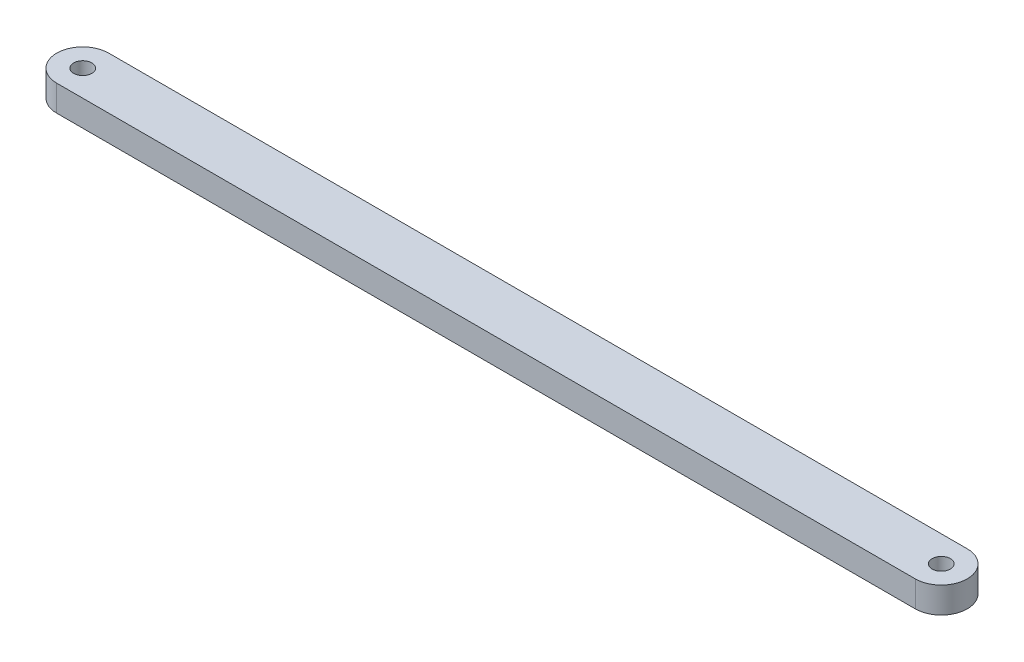
ISO-10303-21;
HEADER;
FILE_DESCRIPTION(('STEP AP214'),'2;1');
FILE_NAME('part.step','',(''),(''),'','','');
FILE_SCHEMA(('AUTOMOTIVE_DESIGN { 1 0 10303 214 1 1 1 1 }'));
ENDSEC;
DATA;
#1=APPLICATION_CONTEXT('core data for automotive mechanical design processes');
#2=APPLICATION_PROTOCOL_DEFINITION('international standard','automotive_design',2000,#1);
#3=PRODUCT_CONTEXT('',#1,'mechanical');
#4=PRODUCT('Part','Part','',(#3));
#5=PRODUCT_RELATED_PRODUCT_CATEGORY('part','',(#4));
#6=PRODUCT_DEFINITION_FORMATION('','',#4);
#7=PRODUCT_DEFINITION_CONTEXT('part definition',#1,'design');
#8=PRODUCT_DEFINITION('design','',#6,#7);
#9=PRODUCT_DEFINITION_SHAPE('','',#8);
#10=(LENGTH_UNIT() NAMED_UNIT(*) SI_UNIT(.MILLI.,.METRE.));
#11=(NAMED_UNIT(*) PLANE_ANGLE_UNIT() SI_UNIT($,.RADIAN.));
#12=(NAMED_UNIT(*) SI_UNIT($,.STERADIAN.) SOLID_ANGLE_UNIT());
#13=UNCERTAINTY_MEASURE_WITH_UNIT(LENGTH_MEASURE(1.E-05),#10,'distance_accuracy_value','');
#14=(GEOMETRIC_REPRESENTATION_CONTEXT(3) GLOBAL_UNCERTAINTY_ASSIGNED_CONTEXT((#13)) GLOBAL_UNIT_ASSIGNED_CONTEXT((#10,
#11,#12)) REPRESENTATION_CONTEXT('',''));
#15=CARTESIAN_POINT('',(0.,0.,0.));
#16=DIRECTION('',(0.,0.,1.));
#17=DIRECTION('',(1.,0.,0.));
#18=AXIS2_PLACEMENT_3D('',#15,#16,#17);
#19=CARTESIAN_POINT('',(-165.,10.,0.));
#20=DIRECTION('',(0.,1.,0.));
#21=DIRECTION('',(0.,0.,1.));
#22=AXIS2_PLACEMENT_3D('',#19,#20,#21);
#23=PLANE('',#22);
#24=CARTESIAN_POINT('',(-165.,10.,0.));
#25=DIRECTION('',(0.,1.,0.));
#26=DIRECTION('',(0.,0.,1.));
#27=AXIS2_PLACEMENT_3D('',#24,#25,#26);
#28=CIRCLE('',#27,3.49999999999999);
#29=CARTESIAN_POINT('',(-165.,10.,3.49999999999999));
#30=VERTEX_POINT('',#29);
#31=EDGE_CURVE('E106',#30,#30,#28,.T.);
#32=ORIENTED_EDGE('',*,*,#31,.F.);
#33=EDGE_LOOP('',(#32));
#34=FACE_BOUND('',#33,.T.);
#35=CARTESIAN_POINT('',(-165.,10.,0.));
#36=DIRECTION('',(0.,1.,0.));
#37=DIRECTION('',(0.,0.,1.));
#38=AXIS2_PLACEMENT_3D('',#35,#36,#37);
#39=CIRCLE('',#38,10.);
#40=CARTESIAN_POINT('',(-165.,10.,-10.));
#41=VERTEX_POINT('',#40);
#42=CARTESIAN_POINT('',(-165.,10.,10.));
#43=VERTEX_POINT('',#42);
#44=EDGE_CURVE('E91',#41,#43,#39,.T.);
#45=ORIENTED_EDGE('',*,*,#44,.T.);
#46=DIRECTION('',(1.,0.,0.));
#47=VECTOR('',#46,1.);
#48=CARTESIAN_POINT('',(-165.,10.,10.));
#49=LINE('',#48,#47);
#50=CARTESIAN_POINT('',(165.,10.,9.99999999999994));
#51=VERTEX_POINT('',#50);
#52=EDGE_CURVE('E86',#43,#51,#49,.T.);
#53=ORIENTED_EDGE('',*,*,#52,.T.);
#54=CARTESIAN_POINT('',(165.,10.,0.));
#55=DIRECTION('',(0.,1.,0.));
#56=DIRECTION('',(0.,0.,1.));
#57=AXIS2_PLACEMENT_3D('',#54,#55,#56);
#58=CIRCLE('',#57,10.);
#59=CARTESIAN_POINT('',(165.,10.,-10.0000000000001));
#60=VERTEX_POINT('',#59);
#61=EDGE_CURVE('E89',#51,#60,#58,.T.);
#62=ORIENTED_EDGE('',*,*,#61,.T.);
#63=DIRECTION('',(-1.,0.,0.));
#64=VECTOR('',#63,1.);
#65=CARTESIAN_POINT('',(-165.,10.,-10.));
#66=LINE('',#65,#64);
#67=EDGE_CURVE('E56',#60,#41,#66,.T.);
#68=ORIENTED_EDGE('',*,*,#67,.T.);
#69=EDGE_LOOP('',(#45,#53,#62,#68));
#70=FACE_BOUND('',#69,.T.);
#71=CARTESIAN_POINT('',(165.,10.,0.));
#72=DIRECTION('',(0.,1.,0.));
#73=DIRECTION('',(0.,0.,1.));
#74=AXIS2_PLACEMENT_3D('',#71,#72,#73);
#75=CIRCLE('',#74,3.49999999999999);
#76=CARTESIAN_POINT('',(165.,10.,3.49999999999993));
#77=VERTEX_POINT('',#76);
#78=EDGE_CURVE('E121',#77,#77,#75,.T.);
#79=ORIENTED_EDGE('',*,*,#78,.F.);
#80=EDGE_LOOP('',(#79));
#81=FACE_BOUND('',#80,.T.);
#82=ADVANCED_FACE('F39',(#34,#70,#81),#23,.T.);
#83=CARTESIAN_POINT('',(-165.,0.,0.));
#84=DIRECTION('',(0.,1.,0.));
#85=DIRECTION('',(0.,0.,1.));
#86=AXIS2_PLACEMENT_3D('',#83,#84,#85);
#87=PLANE('',#86);
#88=CARTESIAN_POINT('',(-165.,0.,0.));
#89=DIRECTION('',(0.,1.,0.));
#90=DIRECTION('',(0.,0.,1.));
#91=AXIS2_PLACEMENT_3D('',#88,#89,#90);
#92=CIRCLE('',#91,10.);
#93=CARTESIAN_POINT('',(-165.,0.,-10.));
#94=VERTEX_POINT('',#93);
#95=CARTESIAN_POINT('',(-165.,0.,10.));
#96=VERTEX_POINT('',#95);
#97=EDGE_CURVE('E103',#94,#96,#92,.T.);
#98=ORIENTED_EDGE('',*,*,#97,.F.);
#99=DIRECTION('',(-1.,0.,0.));
#100=VECTOR('',#99,1.);
#101=CARTESIAN_POINT('',(-165.,0.,-10.));
#102=LINE('',#101,#100);
#103=CARTESIAN_POINT('',(165.,0.,-10.0000000000001));
#104=VERTEX_POINT('',#103);
#105=EDGE_CURVE('E79',#104,#94,#102,.T.);
#106=ORIENTED_EDGE('',*,*,#105,.F.);
#107=CARTESIAN_POINT('',(165.,0.,0.));
#108=DIRECTION('',(0.,1.,0.));
#109=DIRECTION('',(0.,0.,1.));
#110=AXIS2_PLACEMENT_3D('',#107,#108,#109);
#111=CIRCLE('',#110,10.);
#112=CARTESIAN_POINT('',(165.,0.,9.99999999999994));
#113=VERTEX_POINT('',#112);
#114=EDGE_CURVE('E73',#113,#104,#111,.T.);
#115=ORIENTED_EDGE('',*,*,#114,.F.);
#116=DIRECTION('',(1.,0.,0.));
#117=VECTOR('',#116,1.);
#118=CARTESIAN_POINT('',(-165.,0.,10.));
#119=LINE('',#118,#117);
#120=EDGE_CURVE('E95',#96,#113,#119,.T.);
#121=ORIENTED_EDGE('',*,*,#120,.F.);
#122=EDGE_LOOP('',(#98,#106,#115,#121));
#123=FACE_BOUND('',#122,.T.);
#124=CARTESIAN_POINT('',(-165.,0.,0.));
#125=DIRECTION('',(0.,1.,0.));
#126=DIRECTION('',(0.,0.,1.));
#127=AXIS2_PLACEMENT_3D('',#124,#125,#126);
#128=CIRCLE('',#127,3.49999999999999);
#129=CARTESIAN_POINT('',(-165.,0.,3.49999999999999));
#130=VERTEX_POINT('',#129);
#131=EDGE_CURVE('E118',#130,#130,#128,.T.);
#132=ORIENTED_EDGE('',*,*,#131,.T.);
#133=EDGE_LOOP('',(#132));
#134=FACE_BOUND('',#133,.T.);
#135=CARTESIAN_POINT('',(165.,0.,0.));
#136=DIRECTION('',(0.,1.,0.));
#137=DIRECTION('',(0.,0.,1.));
#138=AXIS2_PLACEMENT_3D('',#135,#136,#137);
#139=CIRCLE('',#138,3.49999999999999);
#140=CARTESIAN_POINT('',(165.,0.,3.49999999999993));
#141=VERTEX_POINT('',#140);
#142=EDGE_CURVE('E124',#141,#141,#139,.T.);
#143=ORIENTED_EDGE('',*,*,#142,.T.);
#144=EDGE_LOOP('',(#143));
#145=FACE_BOUND('',#144,.T.);
#146=ADVANCED_FACE('F114',(#123,#134,#145),#87,.F.);
#147=CARTESIAN_POINT('',(-165.,10.,0.));
#148=DIRECTION('',(0.,-1.,0.));
#149=DIRECTION('',(0.,0.,-1.));
#150=AXIS2_PLACEMENT_3D('',#147,#148,#149);
#151=CYLINDRICAL_SURFACE('',#150,10.);
#152=ORIENTED_EDGE('',*,*,#97,.T.);
#153=DIRECTION('',(0.,-1.,0.));
#154=VECTOR('',#153,1.);
#155=CARTESIAN_POINT('',(-165.,10.,10.));
#156=LINE('',#155,#154);
#157=EDGE_CURVE('E11',#43,#96,#156,.T.);
#158=ORIENTED_EDGE('',*,*,#157,.F.);
#159=ORIENTED_EDGE('',*,*,#44,.F.);
#160=DIRECTION('',(0.,-1.,0.));
#161=VECTOR('',#160,1.);
#162=CARTESIAN_POINT('',(-165.,10.,-10.));
#163=LINE('',#162,#161);
#164=EDGE_CURVE('E99',#41,#94,#163,.T.);
#165=ORIENTED_EDGE('',*,*,#164,.T.);
#166=EDGE_LOOP('',(#152,#158,#159,#165));
#167=FACE_BOUND('',#166,.T.);
#168=ADVANCED_FACE('F41',(#167),#151,.T.);
#169=CARTESIAN_POINT('',(-165.,10.,10.));
#170=DIRECTION('',(0.,0.,-1.));
#171=DIRECTION('',(-1.,0.,0.));
#172=AXIS2_PLACEMENT_3D('',#169,#170,#171);
#173=PLANE('',#172);
#174=ORIENTED_EDGE('',*,*,#120,.T.);
#175=DIRECTION('',(0.,-1.,0.));
#176=VECTOR('',#175,1.);
#177=CARTESIAN_POINT('',(165.,10.,9.99999999999994));
#178=LINE('',#177,#176);
#179=EDGE_CURVE('E48',#51,#113,#178,.T.);
#180=ORIENTED_EDGE('',*,*,#179,.F.);
#181=ORIENTED_EDGE('',*,*,#52,.F.);
#182=ORIENTED_EDGE('',*,*,#157,.T.);
#183=EDGE_LOOP('',(#174,#180,#181,#182));
#184=FACE_BOUND('',#183,.T.);
#185=ADVANCED_FACE('F94',(#184),#173,.F.);
#186=CARTESIAN_POINT('',(165.,10.,0.));
#187=DIRECTION('',(0.,-1.,0.));
#188=DIRECTION('',(0.,0.,-1.));
#189=AXIS2_PLACEMENT_3D('',#186,#187,#188);
#190=CYLINDRICAL_SURFACE('',#189,10.);
#191=ORIENTED_EDGE('',*,*,#114,.T.);
#192=DIRECTION('',(0.,-1.,0.));
#193=VECTOR('',#192,1.);
#194=CARTESIAN_POINT('',(165.,10.,-10.0000000000001));
#195=LINE('',#194,#193);
#196=EDGE_CURVE('E96',#60,#104,#195,.T.);
#197=ORIENTED_EDGE('',*,*,#196,.F.);
#198=ORIENTED_EDGE('',*,*,#61,.F.);
#199=ORIENTED_EDGE('',*,*,#179,.T.);
#200=EDGE_LOOP('',(#191,#197,#198,#199));
#201=FACE_BOUND('',#200,.T.);
#202=ADVANCED_FACE('F97',(#201),#190,.T.);
#203=CARTESIAN_POINT('',(-165.,10.,-10.));
#204=DIRECTION('',(0.,0.,1.));
#205=DIRECTION('',(1.,0.,0.));
#206=AXIS2_PLACEMENT_3D('',#203,#204,#205);
#207=PLANE('',#206);
#208=ORIENTED_EDGE('',*,*,#105,.T.);
#209=ORIENTED_EDGE('',*,*,#164,.F.);
#210=ORIENTED_EDGE('',*,*,#67,.F.);
#211=ORIENTED_EDGE('',*,*,#196,.T.);
#212=EDGE_LOOP('',(#208,#209,#210,#211));
#213=FACE_BOUND('',#212,.T.);
#214=ADVANCED_FACE('F111',(#213),#207,.F.);
#215=CARTESIAN_POINT('',(-165.,10.,0.));
#216=DIRECTION('',(0.,-1.,0.));
#217=DIRECTION('',(0.,0.,-1.));
#218=AXIS2_PLACEMENT_3D('',#215,#216,#217);
#219=CYLINDRICAL_SURFACE('',#218,3.49999999999999);
#220=ORIENTED_EDGE('',*,*,#31,.T.);
#221=EDGE_LOOP('',(#220));
#222=FACE_BOUND('',#221,.T.);
#223=ORIENTED_EDGE('',*,*,#131,.F.);
#224=EDGE_LOOP('',(#223));
#225=FACE_BOUND('',#224,.T.);
#226=ADVANCED_FACE('F141',(#222,#225),#219,.F.);
#227=CARTESIAN_POINT('',(165.,10.,0.));
#228=DIRECTION('',(0.,-1.,0.));
#229=DIRECTION('',(0.,0.,-1.));
#230=AXIS2_PLACEMENT_3D('',#227,#228,#229);
#231=CYLINDRICAL_SURFACE('',#230,3.49999999999999);
#232=ORIENTED_EDGE('',*,*,#78,.T.);
#233=EDGE_LOOP('',(#232));
#234=FACE_BOUND('',#233,.T.);
#235=ORIENTED_EDGE('',*,*,#142,.F.);
#236=EDGE_LOOP('',(#235));
#237=FACE_BOUND('',#236,.T.);
#238=ADVANCED_FACE('F130',(#234,#237),#231,.F.);
#239=CLOSED_SHELL('',(#82,#146,#168,#185,#202,#214,#226,#238));
#240=MANIFOLD_SOLID_BREP('B2',#239);
#241=ADVANCED_BREP_SHAPE_REPRESENTATION('',(#18,#240),#14);
#242=SHAPE_DEFINITION_REPRESENTATION(#9,#241);
ENDSEC;
END-ISO-10303-21;
